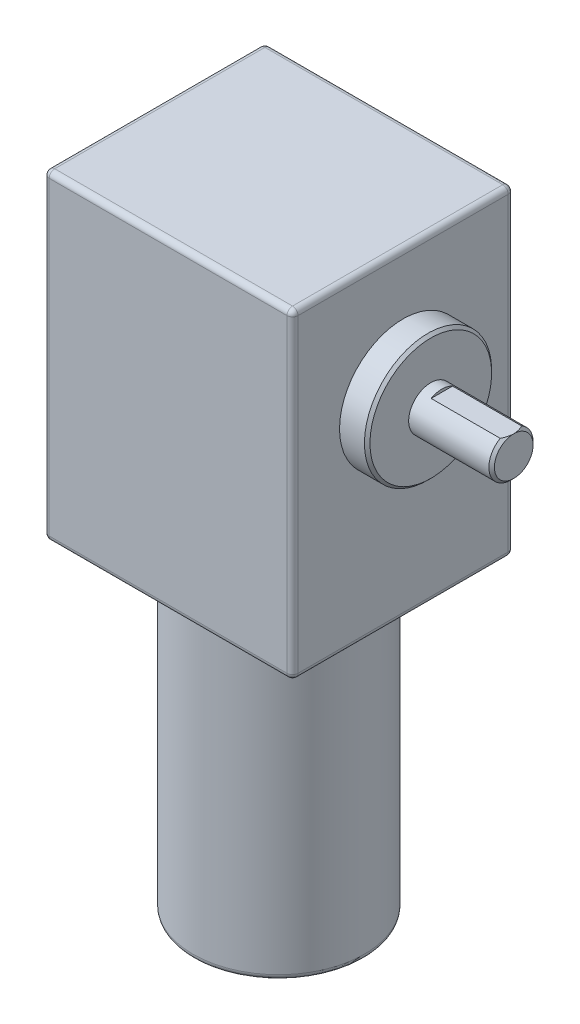
ISO-10303-21;
HEADER;
FILE_DESCRIPTION(('STEP AP214'),'2;1');
FILE_NAME('part.step','',(''),(''),'','','');
FILE_SCHEMA(('AUTOMOTIVE_DESIGN { 1 0 10303 214 1 1 1 1 }'));
ENDSEC;
DATA;
#1=APPLICATION_CONTEXT('core data for automotive mechanical design processes');
#2=APPLICATION_PROTOCOL_DEFINITION('international standard','automotive_design',2000,#1);
#3=PRODUCT_CONTEXT('',#1,'mechanical');
#4=PRODUCT('Part','Part','',(#3));
#5=PRODUCT_RELATED_PRODUCT_CATEGORY('part','',(#4));
#6=PRODUCT_DEFINITION_FORMATION('','',#4);
#7=PRODUCT_DEFINITION_CONTEXT('part definition',#1,'design');
#8=PRODUCT_DEFINITION('design','',#6,#7);
#9=PRODUCT_DEFINITION_SHAPE('','',#8);
#10=(LENGTH_UNIT() NAMED_UNIT(*) SI_UNIT(.MILLI.,.METRE.));
#11=(NAMED_UNIT(*) PLANE_ANGLE_UNIT() SI_UNIT($,.RADIAN.));
#12=(NAMED_UNIT(*) SI_UNIT($,.STERADIAN.) SOLID_ANGLE_UNIT());
#13=UNCERTAINTY_MEASURE_WITH_UNIT(LENGTH_MEASURE(1.E-05),#10,'distance_accuracy_value','');
#14=(GEOMETRIC_REPRESENTATION_CONTEXT(3) GLOBAL_UNCERTAINTY_ASSIGNED_CONTEXT((#13)) GLOBAL_UNIT_ASSIGNED_CONTEXT((#10,
#11,#12)) REPRESENTATION_CONTEXT('',''));
#15=CARTESIAN_POINT('',(0.,0.,0.));
#16=DIRECTION('',(0.,0.,1.));
#17=DIRECTION('',(1.,0.,0.));
#18=AXIS2_PLACEMENT_3D('',#15,#16,#17);
#19=CARTESIAN_POINT('',(15.,0.,0.));
#20=DIRECTION('',(-1.,0.,0.));
#21=DIRECTION('',(0.,0.,1.));
#22=AXIS2_PLACEMENT_3D('',#19,#20,#21);
#23=CYLINDRICAL_SURFACE('',#22,4.);
#24=CARTESIAN_POINT('',(14.5,0.,0.));
#25=DIRECTION('',(1.,0.,0.));
#26=DIRECTION('',(0.,0.,-1.));
#27=AXIS2_PLACEMENT_3D('',#24,#25,#26);
#28=CIRCLE('',#27,4.);
#29=CARTESIAN_POINT('',(14.5,3.5,-1.93649167310371));
#30=VERTEX_POINT('',#29);
#31=CARTESIAN_POINT('',(14.5,3.5,1.93649167310371));
#32=VERTEX_POINT('',#31);
#33=EDGE_CURVE('E158',#30,#32,#28,.F.);
#34=ORIENTED_EDGE('',*,*,#33,.T.);
#35=DIRECTION('',(1.,0.,0.));
#36=VECTOR('',#35,1.);
#37=CARTESIAN_POINT('',(2.,3.5,1.93649167310371));
#38=LINE('',#37,#36);
#39=CARTESIAN_POINT('',(2.,3.5,1.93649167310371));
#40=VERTEX_POINT('',#39);
#41=EDGE_CURVE('E151',#40,#32,#38,.T.);
#42=ORIENTED_EDGE('',*,*,#41,.F.);
#43=CARTESIAN_POINT('',(2.,0.,0.));
#44=DIRECTION('',(1.,0.,0.));
#45=DIRECTION('',(0.,0.,-1.));
#46=AXIS2_PLACEMENT_3D('',#43,#44,#45);
#47=CIRCLE('',#46,4.);
#48=CARTESIAN_POINT('',(2.,3.5,-1.93649167310371));
#49=VERTEX_POINT('',#48);
#50=EDGE_CURVE('E11',#49,#40,#47,.T.);
#51=ORIENTED_EDGE('',*,*,#50,.F.);
#52=DIRECTION('',(1.,0.,0.));
#53=VECTOR('',#52,1.);
#54=CARTESIAN_POINT('',(2.,3.5,-1.93649167310371));
#55=LINE('',#54,#53);
#56=EDGE_CURVE('E152',#49,#30,#55,.T.);
#57=ORIENTED_EDGE('',*,*,#56,.T.);
#58=EDGE_LOOP('',(#34,#42,#51,#57));
#59=FACE_BOUND('',#58,.T.);
#60=CARTESIAN_POINT('',(0.,0.,0.));
#61=DIRECTION('',(1.,0.,0.));
#62=DIRECTION('',(0.,0.,-1.));
#63=AXIS2_PLACEMENT_3D('',#60,#61,#62);
#64=CIRCLE('',#63,4.);
#65=CARTESIAN_POINT('',(0.,0.,-4.));
#66=VERTEX_POINT('',#65);
#67=EDGE_CURVE('E170',#66,#66,#64,.T.);
#68=ORIENTED_EDGE('',*,*,#67,.T.);
#69=EDGE_LOOP('',(#68));
#70=FACE_BOUND('',#69,.T.);
#71=ADVANCED_FACE('F40',(#59,#70),#23,.T.);
#72=CARTESIAN_POINT('',(15.,0.,0.));
#73=DIRECTION('',(1.,0.,0.));
#74=DIRECTION('',(0.,0.,-1.));
#75=AXIS2_PLACEMENT_3D('',#72,#73,#74);
#76=PLANE('',#75);
#77=CARTESIAN_POINT('',(15.,0.,0.));
#78=DIRECTION('',(1.,0.,0.));
#79=DIRECTION('',(0.,0.,-1.));
#80=AXIS2_PLACEMENT_3D('',#77,#78,#79);
#81=CIRCLE('',#80,3.50000000000002);
#82=CARTESIAN_POINT('',(15.,3.50000000000002,0.));
#83=VERTEX_POINT('',#82);
#84=EDGE_CURVE('E186',#83,#83,#81,.T.);
#85=ORIENTED_EDGE('',*,*,#84,.T.);
#86=EDGE_LOOP('',(#85));
#87=FACE_BOUND('',#86,.T.);
#88=ADVANCED_FACE('F420',(#87),#76,.T.);
#89=CARTESIAN_POINT('',(-5.,0.,0.));
#90=DIRECTION('',(1.,0.,0.));
#91=DIRECTION('',(0.,0.,-1.));
#92=AXIS2_PLACEMENT_3D('',#89,#90,#91);
#93=CYLINDRICAL_SURFACE('',#92,11.5);
#94=CARTESIAN_POINT('',(-0.499999999999992,0.,0.));
#95=DIRECTION('',(-1.,0.,0.));
#96=DIRECTION('',(0.,0.,1.));
#97=AXIS2_PLACEMENT_3D('',#94,#95,#96);
#98=CIRCLE('',#97,11.5);
#99=CARTESIAN_POINT('',(-0.499999999999992,0.,11.5));
#100=VERTEX_POINT('',#99);
#101=EDGE_CURVE('E169',#100,#100,#98,.T.);
#102=ORIENTED_EDGE('',*,*,#101,.T.);
#103=EDGE_LOOP('',(#102));
#104=FACE_BOUND('',#103,.T.);
#105=CARTESIAN_POINT('',(-5.,0.,0.));
#106=DIRECTION('',(-1.,0.,0.));
#107=DIRECTION('',(0.,0.,1.));
#108=AXIS2_PLACEMENT_3D('',#105,#106,#107);
#109=CIRCLE('',#108,11.5);
#110=CARTESIAN_POINT('',(-5.,0.,11.5));
#111=VERTEX_POINT('',#110);
#112=EDGE_CURVE('E171',#111,#111,#109,.T.);
#113=ORIENTED_EDGE('',*,*,#112,.F.);
#114=EDGE_LOOP('',(#113));
#115=FACE_BOUND('',#114,.T.);
#116=ADVANCED_FACE('F416',(#104,#115),#93,.T.);
#117=CARTESIAN_POINT('',(0.,0.,0.));
#118=DIRECTION('',(-1.,0.,0.));
#119=DIRECTION('',(0.,0.,1.));
#120=AXIS2_PLACEMENT_3D('',#117,#118,#119);
#121=PLANE('',#120);
#122=CARTESIAN_POINT('',(0.,0.,0.));
#123=DIRECTION('',(-1.,0.,0.));
#124=DIRECTION('',(0.,0.,1.));
#125=AXIS2_PLACEMENT_3D('',#122,#123,#124);
#126=CIRCLE('',#125,11.);
#127=CARTESIAN_POINT('',(0.,0.,11.));
#128=VERTEX_POINT('',#127);
#129=EDGE_CURVE('E182',#128,#128,#126,.F.);
#130=ORIENTED_EDGE('',*,*,#129,.T.);
#131=EDGE_LOOP('',(#130));
#132=FACE_BOUND('',#131,.T.);
#133=ORIENTED_EDGE('',*,*,#67,.F.);
#134=EDGE_LOOP('',(#133));
#135=FACE_BOUND('',#134,.T.);
#136=ADVANCED_FACE('F413',(#132,#135),#121,.F.);
#137=CARTESIAN_POINT('',(-50.,-35.5,-20.));
#138=DIRECTION('',(0.,0.,1.));
#139=DIRECTION('',(1.,0.,0.));
#140=AXIS2_PLACEMENT_3D('',#137,#138,#139);
#141=PLANE('',#140);
#142=DIRECTION('',(0.,-1.,0.));
#143=VECTOR('',#142,1.);
#144=CARTESIAN_POINT('',(-49.,22.5,-20.));
#145=LINE('',#144,#143);
#146=CARTESIAN_POINT('',(-49.,-34.5,-20.));
#147=VERTEX_POINT('',#146);
#148=CARTESIAN_POINT('',(-49.,21.5,-20.));
#149=VERTEX_POINT('',#148);
#150=EDGE_CURVE('E63',#147,#149,#145,.F.);
#151=ORIENTED_EDGE('',*,*,#150,.T.);
#152=DIRECTION('',(1.,0.,0.));
#153=VECTOR('',#152,1.);
#154=CARTESIAN_POINT('',(-50.,21.5,-20.));
#155=LINE('',#154,#153);
#156=CARTESIAN_POINT('',(-6.,21.5,-20.));
#157=VERTEX_POINT('',#156);
#158=EDGE_CURVE('E265',#149,#157,#155,.T.);
#159=ORIENTED_EDGE('',*,*,#158,.T.);
#160=DIRECTION('',(0.,-1.,0.));
#161=VECTOR('',#160,1.);
#162=CARTESIAN_POINT('',(-6.,-35.5,-20.));
#163=LINE('',#162,#161);
#164=CARTESIAN_POINT('',(-6.,-34.5,-20.));
#165=VERTEX_POINT('',#164);
#166=EDGE_CURVE('E257',#157,#165,#163,.T.);
#167=ORIENTED_EDGE('',*,*,#166,.T.);
#168=DIRECTION('',(1.,0.,0.));
#169=VECTOR('',#168,1.);
#170=CARTESIAN_POINT('',(-50.,-34.5,-20.));
#171=LINE('',#170,#169);
#172=EDGE_CURVE('E260',#165,#147,#171,.F.);
#173=ORIENTED_EDGE('',*,*,#172,.T.);
#174=EDGE_LOOP('',(#151,#159,#167,#173));
#175=FACE_BOUND('',#174,.T.);
#176=ADVANCED_FACE('F409',(#175),#141,.F.);
#177=CARTESIAN_POINT('',(-50.,-35.5,20.));
#178=DIRECTION('',(0.,1.,0.));
#179=DIRECTION('',(0.,0.,1.));
#180=AXIS2_PLACEMENT_3D('',#177,#178,#179);
#181=PLANE('',#180);
#182=DIRECTION('',(0.,0.,1.));
#183=VECTOR('',#182,1.);
#184=CARTESIAN_POINT('',(-6.,-35.5,20.));
#185=LINE('',#184,#183);
#186=CARTESIAN_POINT('',(-6.,-35.5,-19.));
#187=VERTEX_POINT('',#186);
#188=CARTESIAN_POINT('',(-6.,-35.5,19.));
#189=VERTEX_POINT('',#188);
#190=EDGE_CURVE('E208',#187,#189,#185,.T.);
#191=ORIENTED_EDGE('',*,*,#190,.T.);
#192=DIRECTION('',(1.,0.,0.));
#193=VECTOR('',#192,1.);
#194=CARTESIAN_POINT('',(-50.,-35.5,19.));
#195=LINE('',#194,#193);
#196=CARTESIAN_POINT('',(-49.,-35.5,19.));
#197=VERTEX_POINT('',#196);
#198=EDGE_CURVE('E215',#189,#197,#195,.F.);
#199=ORIENTED_EDGE('',*,*,#198,.T.);
#200=DIRECTION('',(0.,0.,1.));
#201=VECTOR('',#200,1.);
#202=CARTESIAN_POINT('',(-49.,-35.5,-20.));
#203=LINE('',#202,#201);
#204=CARTESIAN_POINT('',(-49.,-35.5,-19.));
#205=VERTEX_POINT('',#204);
#206=EDGE_CURVE('E211',#197,#205,#203,.F.);
#207=ORIENTED_EDGE('',*,*,#206,.T.);
#208=DIRECTION('',(1.,0.,0.));
#209=VECTOR('',#208,1.);
#210=CARTESIAN_POINT('',(-50.,-35.5,-19.));
#211=LINE('',#210,#209);
#212=EDGE_CURVE('E205',#205,#187,#211,.T.);
#213=ORIENTED_EDGE('',*,*,#212,.T.);
#214=EDGE_LOOP('',(#191,#199,#207,#213));
#215=FACE_BOUND('',#214,.T.);
#216=CARTESIAN_POINT('',(-27.5,-35.5,0.));
#217=DIRECTION('',(0.,-1.,0.));
#218=DIRECTION('',(0.,0.,-1.));
#219=AXIS2_PLACEMENT_3D('',#216,#217,#218);
#220=CIRCLE('',#219,15.5);
#221=CARTESIAN_POINT('',(-27.5,-35.5,15.5));
#222=VERTEX_POINT('',#221);
#223=EDGE_CURVE('E165',#222,#222,#220,.T.);
#224=ORIENTED_EDGE('',*,*,#223,.F.);
#225=EDGE_LOOP('',(#224));
#226=FACE_BOUND('',#225,.T.);
#227=ADVANCED_FACE('F405',(#215,#226),#181,.F.);
#228=CARTESIAN_POINT('',(-50.,-35.5,20.));
#229=DIRECTION('',(0.,0.,-1.));
#230=DIRECTION('',(-1.,0.,0.));
#231=AXIS2_PLACEMENT_3D('',#228,#229,#230);
#232=PLANE('',#231);
#233=DIRECTION('',(0.,1.,0.));
#234=VECTOR('',#233,1.);
#235=CARTESIAN_POINT('',(-49.,-35.5,20.));
#236=LINE('',#235,#234);
#237=CARTESIAN_POINT('',(-49.,21.5,20.));
#238=VERTEX_POINT('',#237);
#239=CARTESIAN_POINT('',(-49.,-34.5,20.));
#240=VERTEX_POINT('',#239);
#241=EDGE_CURVE('E250',#238,#240,#236,.F.);
#242=ORIENTED_EDGE('',*,*,#241,.T.);
#243=DIRECTION('',(1.,0.,0.));
#244=VECTOR('',#243,1.);
#245=CARTESIAN_POINT('',(-50.,-34.5,20.));
#246=LINE('',#245,#244);
#247=CARTESIAN_POINT('',(-6.,-34.5,20.));
#248=VERTEX_POINT('',#247);
#249=EDGE_CURVE('E253',#240,#248,#246,.T.);
#250=ORIENTED_EDGE('',*,*,#249,.T.);
#251=DIRECTION('',(0.,1.,0.));
#252=VECTOR('',#251,1.);
#253=CARTESIAN_POINT('',(-6.,-35.5,20.));
#254=LINE('',#253,#252);
#255=CARTESIAN_POINT('',(-6.,21.5,20.));
#256=VERTEX_POINT('',#255);
#257=EDGE_CURVE('E244',#248,#256,#254,.T.);
#258=ORIENTED_EDGE('',*,*,#257,.T.);
#259=DIRECTION('',(1.,0.,0.));
#260=VECTOR('',#259,1.);
#261=CARTESIAN_POINT('',(-50.,21.5,20.));
#262=LINE('',#261,#260);
#263=EDGE_CURVE('E247',#256,#238,#262,.F.);
#264=ORIENTED_EDGE('',*,*,#263,.T.);
#265=EDGE_LOOP('',(#242,#250,#258,#264));
#266=FACE_BOUND('',#265,.T.);
#267=ADVANCED_FACE('F401',(#266),#232,.F.);
#268=CARTESIAN_POINT('',(-50.,22.5,20.));
#269=DIRECTION('',(0.,-1.,0.));
#270=DIRECTION('',(0.,0.,-1.));
#271=AXIS2_PLACEMENT_3D('',#268,#269,#270);
#272=PLANE('',#271);
#273=DIRECTION('',(0.,0.,-1.));
#274=VECTOR('',#273,1.);
#275=CARTESIAN_POINT('',(-49.,22.5,20.));
#276=LINE('',#275,#274);
#277=CARTESIAN_POINT('',(-49.,22.5,-19.));
#278=VERTEX_POINT('',#277);
#279=CARTESIAN_POINT('',(-49.,22.5,19.));
#280=VERTEX_POINT('',#279);
#281=EDGE_CURVE('E237',#278,#280,#276,.F.);
#282=ORIENTED_EDGE('',*,*,#281,.T.);
#283=DIRECTION('',(1.,0.,0.));
#284=VECTOR('',#283,1.);
#285=CARTESIAN_POINT('',(-50.,22.5,19.));
#286=LINE('',#285,#284);
#287=CARTESIAN_POINT('',(-6.,22.5,19.));
#288=VERTEX_POINT('',#287);
#289=EDGE_CURVE('E241',#280,#288,#286,.T.);
#290=ORIENTED_EDGE('',*,*,#289,.T.);
#291=DIRECTION('',(0.,0.,-1.));
#292=VECTOR('',#291,1.);
#293=CARTESIAN_POINT('',(-6.,22.5,20.));
#294=LINE('',#293,#292);
#295=CARTESIAN_POINT('',(-6.,22.5,-19.));
#296=VERTEX_POINT('',#295);
#297=EDGE_CURVE('E234',#288,#296,#294,.T.);
#298=ORIENTED_EDGE('',*,*,#297,.T.);
#299=DIRECTION('',(1.,0.,0.));
#300=VECTOR('',#299,1.);
#301=CARTESIAN_POINT('',(-50.,22.5,-19.));
#302=LINE('',#301,#300);
#303=EDGE_CURVE('E231',#296,#278,#302,.F.);
#304=ORIENTED_EDGE('',*,*,#303,.T.);
#305=EDGE_LOOP('',(#282,#290,#298,#304));
#306=FACE_BOUND('',#305,.T.);
#307=ADVANCED_FACE('F394',(#306),#272,.F.);
#308=CARTESIAN_POINT('',(-50.,0.,0.));
#309=DIRECTION('',(-1.,0.,0.));
#310=DIRECTION('',(0.,0.,1.));
#311=AXIS2_PLACEMENT_3D('',#308,#309,#310);
#312=PLANE('',#311);
#313=DIRECTION('',(0.,0.,1.));
#314=VECTOR('',#313,1.);
#315=CARTESIAN_POINT('',(-50.,-34.5,20.));
#316=LINE('',#315,#314);
#317=CARTESIAN_POINT('',(-50.,-34.5,-19.));
#318=VERTEX_POINT('',#317);
#319=CARTESIAN_POINT('',(-50.,-34.5,19.));
#320=VERTEX_POINT('',#319);
#321=EDGE_CURVE('E198',#318,#320,#316,.T.);
#322=ORIENTED_EDGE('',*,*,#321,.T.);
#323=DIRECTION('',(0.,1.,0.));
#324=VECTOR('',#323,1.);
#325=CARTESIAN_POINT('',(-50.,22.5,19.));
#326=LINE('',#325,#324);
#327=CARTESIAN_POINT('',(-50.,21.5,19.));
#328=VERTEX_POINT('',#327);
#329=EDGE_CURVE('E202',#320,#328,#326,.T.);
#330=ORIENTED_EDGE('',*,*,#329,.T.);
#331=DIRECTION('',(0.,0.,-1.));
#332=VECTOR('',#331,1.);
#333=CARTESIAN_POINT('',(-50.,21.5,-20.));
#334=LINE('',#333,#332);
#335=CARTESIAN_POINT('',(-50.,21.5,-19.));
#336=VERTEX_POINT('',#335);
#337=EDGE_CURVE('E195',#328,#336,#334,.T.);
#338=ORIENTED_EDGE('',*,*,#337,.T.);
#339=DIRECTION('',(0.,-1.,0.));
#340=VECTOR('',#339,1.);
#341=CARTESIAN_POINT('',(-50.,-35.5,-19.));
#342=LINE('',#341,#340);
#343=EDGE_CURVE('E192',#336,#318,#342,.T.);
#344=ORIENTED_EDGE('',*,*,#343,.T.);
#345=EDGE_LOOP('',(#322,#330,#338,#344));
#346=FACE_BOUND('',#345,.T.);
#347=ADVANCED_FACE('F391',(#346),#312,.T.);
#348=CARTESIAN_POINT('',(-5.,0.,0.));
#349=DIRECTION('',(-1.,0.,0.));
#350=DIRECTION('',(0.,0.,1.));
#351=AXIS2_PLACEMENT_3D('',#348,#349,#350);
#352=PLANE('',#351);
#353=DIRECTION('',(0.,0.,-1.));
#354=VECTOR('',#353,1.);
#355=CARTESIAN_POINT('',(-5.,21.5,0.));
#356=LINE('',#355,#354);
#357=CARTESIAN_POINT('',(-5.,21.5,-19.));
#358=VERTEX_POINT('',#357);
#359=CARTESIAN_POINT('',(-5.,21.5,19.));
#360=VERTEX_POINT('',#359);
#361=EDGE_CURVE('E221',#358,#360,#356,.F.);
#362=ORIENTED_EDGE('',*,*,#361,.T.);
#363=DIRECTION('',(0.,1.,0.));
#364=VECTOR('',#363,1.);
#365=CARTESIAN_POINT('',(-5.,0.,19.));
#366=LINE('',#365,#364);
#367=CARTESIAN_POINT('',(-5.,-34.5,19.));
#368=VERTEX_POINT('',#367);
#369=EDGE_CURVE('E228',#360,#368,#366,.F.);
#370=ORIENTED_EDGE('',*,*,#369,.T.);
#371=DIRECTION('',(0.,0.,1.));
#372=VECTOR('',#371,1.);
#373=CARTESIAN_POINT('',(-5.,-34.5,0.));
#374=LINE('',#373,#372);
#375=CARTESIAN_POINT('',(-5.,-34.5,-19.));
#376=VERTEX_POINT('',#375);
#377=EDGE_CURVE('E224',#368,#376,#374,.F.);
#378=ORIENTED_EDGE('',*,*,#377,.T.);
#379=DIRECTION('',(0.,-1.,0.));
#380=VECTOR('',#379,1.);
#381=CARTESIAN_POINT('',(-5.,0.,-19.));
#382=LINE('',#381,#380);
#383=EDGE_CURVE('E218',#376,#358,#382,.F.);
#384=ORIENTED_EDGE('',*,*,#383,.T.);
#385=EDGE_LOOP('',(#362,#370,#378,#384));
#386=FACE_BOUND('',#385,.T.);
#387=ORIENTED_EDGE('',*,*,#112,.T.);
#388=EDGE_LOOP('',(#387));
#389=FACE_BOUND('',#388,.T.);
#390=ADVANCED_FACE('F389',(#386,#389),#352,.F.);
#391=CARTESIAN_POINT('',(-27.5,-92.5,0.));
#392=DIRECTION('',(0.,1.,0.));
#393=DIRECTION('',(0.,0.,1.));
#394=AXIS2_PLACEMENT_3D('',#391,#392,#393);
#395=CYLINDRICAL_SURFACE('',#394,15.5);
#396=CARTESIAN_POINT('',(-27.5,-91.5,0.));
#397=DIRECTION('',(0.,-1.,0.));
#398=DIRECTION('',(0.,0.,-1.));
#399=AXIS2_PLACEMENT_3D('',#396,#397,#398);
#400=CIRCLE('',#399,15.5);
#401=CARTESIAN_POINT('',(-27.5,-91.5,15.5));
#402=VERTEX_POINT('',#401);
#403=EDGE_CURVE('E272',#402,#402,#400,.F.);
#404=CARTESIAN_POINT('',(-27.5,-91.5,15.5));
#405=CARTESIAN_POINT('',(-27.5,-90.9166666666667,15.5));
#406=CARTESIAN_POINT('',(-27.5,-90.3333333333333,15.5));
#407=CARTESIAN_POINT('',(-27.5,-89.1666666666667,15.5));
#408=CARTESIAN_POINT('',(-27.5,-88.5833333333333,15.5));
#409=CARTESIAN_POINT('',(-27.5,-87.4166666666667,15.5));
#410=CARTESIAN_POINT('',(-27.5,-86.8333333333333,15.5));
#411=CARTESIAN_POINT('',(-27.5,-85.6666666666667,15.5));
#412=CARTESIAN_POINT('',(-27.5,-85.0833333333333,15.5));
#413=CARTESIAN_POINT('',(-27.5,-83.9166666666667,15.5));
#414=CARTESIAN_POINT('',(-27.5,-83.3333333333333,15.5));
#415=CARTESIAN_POINT('',(-27.5,-82.1666666666667,15.5));
#416=CARTESIAN_POINT('',(-27.5,-81.5833333333333,15.5));
#417=CARTESIAN_POINT('',(-27.5,-80.4166666666667,15.5));
#418=CARTESIAN_POINT('',(-27.5,-79.8333333333333,15.5));
#419=CARTESIAN_POINT('',(-27.5,-78.6666666666666,15.5));
#420=CARTESIAN_POINT('',(-27.5,-78.0833333333333,15.5));
#421=CARTESIAN_POINT('',(-27.5,-76.9166666666667,15.5));
#422=CARTESIAN_POINT('',(-27.5,-76.3333333333333,15.5));
#423=CARTESIAN_POINT('',(-27.5,-75.1666666666667,15.5));
#424=CARTESIAN_POINT('',(-27.5,-74.5833333333333,15.5));
#425=CARTESIAN_POINT('',(-27.5,-73.4166666666667,15.5));
#426=CARTESIAN_POINT('',(-27.5,-72.8333333333333,15.5));
#427=CARTESIAN_POINT('',(-27.5,-71.6666666666667,15.5));
#428=CARTESIAN_POINT('',(-27.5,-71.0833333333333,15.5));
#429=CARTESIAN_POINT('',(-27.5,-69.9166666666667,15.5));
#430=CARTESIAN_POINT('',(-27.5,-69.3333333333333,15.5));
#431=CARTESIAN_POINT('',(-27.5,-68.1666666666667,15.5));
#432=CARTESIAN_POINT('',(-27.5,-67.5833333333333,15.5));
#433=CARTESIAN_POINT('',(-27.5,-66.4166666666667,15.5));
#434=CARTESIAN_POINT('',(-27.5,-65.8333333333333,15.5));
#435=CARTESIAN_POINT('',(-27.5,-64.6666666666667,15.5));
#436=CARTESIAN_POINT('',(-27.5,-64.0833333333333,15.5));
#437=CARTESIAN_POINT('',(-27.5,-62.9166666666667,15.5));
#438=CARTESIAN_POINT('',(-27.5,-62.3333333333333,15.5));
#439=CARTESIAN_POINT('',(-27.5,-61.1666666666667,15.5));
#440=CARTESIAN_POINT('',(-27.5,-60.5833333333333,15.5));
#441=CARTESIAN_POINT('',(-27.5,-59.4166666666667,15.5));
#442=CARTESIAN_POINT('',(-27.5,-58.8333333333333,15.5));
#443=CARTESIAN_POINT('',(-27.5,-57.6666666666667,15.5));
#444=CARTESIAN_POINT('',(-27.5,-57.0833333333333,15.5));
#445=CARTESIAN_POINT('',(-27.5,-55.9166666666667,15.5));
#446=CARTESIAN_POINT('',(-27.5,-55.3333333333333,15.5));
#447=CARTESIAN_POINT('',(-27.5,-54.1666666666667,15.5));
#448=CARTESIAN_POINT('',(-27.5,-53.5833333333333,15.5));
#449=CARTESIAN_POINT('',(-27.5,-52.4166666666667,15.5));
#450=CARTESIAN_POINT('',(-27.5,-51.8333333333333,15.5));
#451=CARTESIAN_POINT('',(-27.5,-50.6666666666667,15.5));
#452=CARTESIAN_POINT('',(-27.5,-50.0833333333333,15.5));
#453=CARTESIAN_POINT('',(-27.5,-48.9166666666667,15.5));
#454=CARTESIAN_POINT('',(-27.5,-48.3333333333333,15.5));
#455=CARTESIAN_POINT('',(-27.5,-47.1666666666667,15.5));
#456=CARTESIAN_POINT('',(-27.5,-46.5833333333333,15.5));
#457=CARTESIAN_POINT('',(-27.5,-45.4166666666667,15.5));
#458=CARTESIAN_POINT('',(-27.5,-44.8333333333333,15.5));
#459=CARTESIAN_POINT('',(-27.5,-43.6666666666667,15.5));
#460=CARTESIAN_POINT('',(-27.5,-43.0833333333333,15.5));
#461=CARTESIAN_POINT('',(-27.5,-41.9166666666667,15.5));
#462=CARTESIAN_POINT('',(-27.5,-41.3333333333333,15.5));
#463=CARTESIAN_POINT('',(-27.5,-40.1666666666667,15.5));
#464=CARTESIAN_POINT('',(-27.5,-39.5833333333333,15.5));
#465=CARTESIAN_POINT('',(-27.5,-38.4166666666667,15.5));
#466=CARTESIAN_POINT('',(-27.5,-37.8333333333333,15.5));
#467=CARTESIAN_POINT('',(-27.5,-36.6666666666667,15.5));
#468=CARTESIAN_POINT('',(-27.5,-36.0833333333333,15.5));
#469=CARTESIAN_POINT('',(-27.5,-35.5,15.5));
#470=B_SPLINE_CURVE_WITH_KNOTS('',3,(#404,#405,#406,#407,#408,#409,#410,#411,#412,#413,#414,
#415,#416,#417,#418,#419,#420,#421,#422,#423,#424,#425,#426,#427,#428,#429,#430,#431,#432,#433,
#434,#435,#436,#437,#438,#439,#440,#441,#442,#443,#444,#445,#446,#447,#448,#449,#450,#451,#452,
#453,#454,#455,#456,#457,#458,#459,#460,#461,#462,#463,#464,#465,#466,#467,#468,#469),
.UNSPECIFIED.,.F.,.F.,(4,2,2,2,2,2,2,2,2,2,2,2,2,2,2,2,2,2,2,2,2,2,2,2,2,2,2,2,2,2,2,2,4),(0.,
1.74999999999999,3.49999999999999,5.24999999999999,6.99999999999999,8.74999999999999,10.5,12.25,
14.,15.75,17.5,19.25,21.,22.75,24.5,26.25,28.,29.75,31.5,33.25,35.,36.75,38.5,40.25,42.,43.75,
45.5,47.25,49.,50.75,52.5,54.25,56.),.UNSPECIFIED.);
#471=EDGE_CURVE('BSEAM385',#402,#222,#470,.T.);
#472=ORIENTED_EDGE('',*,*,#403,.T.);
#473=ORIENTED_EDGE('',*,*,#223,.T.);
#474=ORIENTED_EDGE('',*,*,#471,.T.);
#475=ORIENTED_EDGE('',*,*,#471,.F.);
#476=EDGE_LOOP('',(#472,#474,#473,#475));
#477=FACE_BOUND('',#476,.T.);
#478=ADVANCED_FACE('F385',(#477),#395,.T.);
#479=CARTESIAN_POINT('',(-27.5,-92.5,0.));
#480=DIRECTION('',(0.,-1.,0.));
#481=DIRECTION('',(0.,0.,-1.));
#482=AXIS2_PLACEMENT_3D('',#479,#480,#481);
#483=PLANE('',#482);
#484=CARTESIAN_POINT('',(-27.5,-92.5,0.));
#485=DIRECTION('',(0.,-1.,0.));
#486=DIRECTION('',(0.,0.,-1.));
#487=AXIS2_PLACEMENT_3D('',#484,#485,#486);
#488=CIRCLE('',#487,14.5);
#489=CARTESIAN_POINT('',(-27.5,-92.5,-14.5));
#490=VERTEX_POINT('',#489);
#491=EDGE_CURVE('E268',#490,#490,#488,.T.);
#492=ORIENTED_EDGE('',*,*,#491,.T.);
#493=EDGE_LOOP('',(#492));
#494=FACE_BOUND('',#493,.T.);
#495=ADVANCED_FACE('F381',(#494),#483,.T.);
#496=CARTESIAN_POINT('',(-0.499999999999992,0.,0.));
#497=DIRECTION('',(-1.,0.,0.));
#498=DIRECTION('',(0.,0.,1.));
#499=AXIS2_PLACEMENT_3D('',#496,#497,#498);
#500=CONICAL_SURFACE('',#499,11.5,0.785398163397447);
#501=ORIENTED_EDGE('',*,*,#129,.F.);
#502=EDGE_LOOP('',(#501));
#503=FACE_BOUND('',#502,.T.);
#504=ORIENTED_EDGE('',*,*,#101,.F.);
#505=EDGE_LOOP('',(#504));
#506=FACE_BOUND('',#505,.T.);
#507=ADVANCED_FACE('F384',(#503,#506),#500,.T.);
#508=CARTESIAN_POINT('',(15.,0.,0.));
#509=DIRECTION('',(-1.,0.,0.));
#510=DIRECTION('',(0.,0.,1.));
#511=AXIS2_PLACEMENT_3D('',#508,#509,#510);
#512=CONICAL_SURFACE('',#511,3.50000000000002,0.785398163397447);
#513=CARTESIAN_POINT('',(11.6899471258397,3.5,5.84181651105703));
#514=CARTESIAN_POINT('',(11.8395427861511,3.5,5.66735393936486));
#515=CARTESIAN_POINT('',(11.9881954210432,3.5,5.49206547113774));
#516=CARTESIAN_POINT('',(12.2829447720812,3.5,5.13920313663014));
#517=CARTESIAN_POINT('',(12.4290401400104,3.5,4.9616281456963));
#518=CARTESIAN_POINT('',(12.7216498436301,3.5,4.59902841847941));
#519=CARTESIAN_POINT('',(12.8680740607516,3.5,4.41393060280333));
#520=CARTESIAN_POINT('',(13.1560543006146,3.5,4.04004823799611));
#521=CARTESIAN_POINT('',(13.297611554435,3.5,3.85126464039525));
#522=CARTESIAN_POINT('',(13.5742819676444,3.5,3.4684717709667));
#523=CARTESIAN_POINT('',(13.709383433517,3.5,3.27445394365403));
#524=CARTESIAN_POINT('',(13.9047854482887,3.5,2.9784971811169));
#525=CARTESIAN_POINT('',(13.9687407444497,3.5,2.87897311573411));
#526=CARTESIAN_POINT('',(14.093657933459,3.5,2.67806902832483));
#527=CARTESIAN_POINT('',(14.1546200626617,3.5,2.57668915371245));
#528=CARTESIAN_POINT('',(14.2723345746304,3.5,2.37276611513997));
#529=CARTESIAN_POINT('',(14.3291212420944,3.5,2.27024294407419));
#530=CARTESIAN_POINT('',(14.4382656351064,3.5,2.06287588995989));
#531=CARTESIAN_POINT('',(14.490622835163,3.5,1.95803173341671));
#532=CARTESIAN_POINT('',(14.639392080392,3.5,1.63994654672309));
#533=CARTESIAN_POINT('',(14.727775746879,3.5,1.42269566249373));
#534=CARTESIAN_POINT('',(14.8370059061703,3.5,1.08589626758145));
#535=CARTESIAN_POINT('',(14.8697948321508,3.5,0.970207598620513));
#536=CARTESIAN_POINT('',(14.9251763288505,3.5,0.736379807759468));
#537=CARTESIAN_POINT('',(14.94777052291,3.5,0.618241079126182));
#538=CARTESIAN_POINT('',(14.9812859571545,3.5,0.380879908496849));
#539=CARTESIAN_POINT('',(14.992263710395,3.5,0.261665585444833));
#540=CARTESIAN_POINT('',(15.0019613422117,3.5,0.0227331034399934));
#541=CARTESIAN_POINT('',(15.0006817870024,3.5,-0.0969850319843476));
#542=CARTESIAN_POINT('',(14.9859714756814,3.5,-0.335487466432786));
#543=CARTESIAN_POINT('',(14.9725577561206,3.5,-0.454272839281214));
#544=CARTESIAN_POINT('',(14.9345295265572,3.5,-0.690022062147998));
#545=CARTESIAN_POINT('',(14.9099131164912,3.5,-0.806985599687082));
#546=CARTESIAN_POINT('',(14.8507452514513,3.5,-1.03910972308809));
#547=CARTESIAN_POINT('',(14.8161327378705,3.5,-1.15425449665019));
#548=CARTESIAN_POINT('',(14.7386658596439,3.5,-1.38169186109189));
#549=CARTESIAN_POINT('',(14.6958117485251,3.5,-1.49398453958702));
#550=CARTESIAN_POINT('',(14.5890420587657,3.5,-1.75015942781327));
#551=CARTESIAN_POINT('',(14.5227174659705,3.5,-1.89303092730609));
#552=CARTESIAN_POINT('',(14.3813440799751,3.5,-2.17442767273329));
#553=CARTESIAN_POINT('',(14.3062899304985,3.5,-2.31295018332319));
#554=CARTESIAN_POINT('',(14.1494392310383,3.5,-2.58649511142916));
#555=CARTESIAN_POINT('',(14.0676283145599,3.5,-2.72150922459222));
#556=CARTESIAN_POINT('',(13.8989905353675,3.5,-2.98830469597387));
#557=CARTESIAN_POINT('',(13.8121647448185,3.5,-3.12008673667948));
#558=CARTESIAN_POINT('',(13.6341931179746,3.5,-3.38161136797615));
#559=CARTESIAN_POINT('',(13.5430286049175,3.5,-3.51134118879959));
#560=CARTESIAN_POINT('',(13.3576081785151,3.5,-3.76857209228672));
#561=CARTESIAN_POINT('',(13.2633521395112,3.5,-3.89607308403343));
#562=CARTESIAN_POINT('',(13.0724926425957,3.5,-4.14906249810053));
#563=CARTESIAN_POINT('',(12.9758921161339,3.5,-4.27455313784457));
#564=CARTESIAN_POINT('',(12.7807020979541,3.5,-4.52397933448188));
#565=CARTESIAN_POINT('',(12.682112554998,3.5,-4.64791485118069));
#566=CARTESIAN_POINT('',(12.4363054496243,3.5,-4.95277252343934));
#567=CARTESIAN_POINT('',(12.2881385211466,3.5,-5.13292902069894));
#568=CARTESIAN_POINT('',(12.0644625856483,3.5,-5.4007881452577));
#569=CARTESIAN_POINT('',(11.9899607875542,3.5,-5.48933647749916));
#570=CARTESIAN_POINT('',(11.840373832225,3.5,-5.66593520127804));
#571=CARTESIAN_POINT('',(11.765288690206,3.5,-5.75398560570074));
#572=CARTESIAN_POINT('',(11.6899471258398,3.5,-5.84181651105706));
#573=B_SPLINE_CURVE_WITH_KNOTS('',3,(#513,#514,#515,#516,#517,#518,#519,#520,#521,#522,#523,
#524,#525,#526,#527,#528,#529,#530,#531,#532,#533,#534,#535,#536,#537,#538,#539,#540,#541,#542,
#543,#544,#545,#546,#547,#548,#549,#550,#551,#552,#553,#554,#555,#556,#557,#558,#559,#560,#561,
#562,#563,#564,#565,#566,#567,#568,#569,#570,#571,#572),.UNSPECIFIED.,.F.,.F.,(4,2,2,2,2,2,2,2,
2,2,2,2,2,2,2,2,2,2,2,2,2,2,2,2,2,2,2,2,2,4),(0.,0.689468185585012,1.37928953616029,
2.08726122955687,2.79505250676938,3.50408066758653,3.85894382643688,4.21377891840809,
4.56526700626636,4.91679673474138,5.6182622265377,5.97863378950202,6.33894794905833,
6.69750103491053,7.05603755783257,7.41407147000541,7.77216613015949,8.13249613527578,
8.4928150577387,8.96494773972697,9.43737165621834,9.91082727948629,10.3841820513867,
10.8598009205065,11.3354391457107,11.8105105208123,12.2855941496473,12.9853321556878,
13.33249318543,13.6796451899034),.UNSPECIFIED.);
#574=EDGE_CURVE('E49',#32,#83,#573,.T.);
#575=ORIENTED_EDGE('',*,*,#574,.F.);
#576=ORIENTED_EDGE('',*,*,#33,.F.);
#577=EDGE_CURVE('E276',#83,#30,#573,.T.);
#578=ORIENTED_EDGE('',*,*,#577,.F.);
#579=ORIENTED_EDGE('',*,*,#84,.F.);
#580=EDGE_LOOP('',(#575,#576,#578,#579));
#581=FACE_BOUND('',#580,.T.);
#582=ADVANCED_FACE('F373',(#581),#512,.T.);
#583=CARTESIAN_POINT('',(-6.,21.5,20.));
#584=DIRECTION('',(0.,0.,-1.));
#585=DIRECTION('',(-1.,0.,0.));
#586=AXIS2_PLACEMENT_3D('',#583,#584,#585);
#587=CYLINDRICAL_SURFACE('',#586,1.);
#588=CARTESIAN_POINT('',(-6.,21.5,-19.));
#589=DIRECTION('',(0.,0.,-1.));
#590=DIRECTION('',(-1.,0.,0.));
#591=AXIS2_PLACEMENT_3D('',#588,#589,#590);
#592=CIRCLE('',#591,1.);
#593=EDGE_CURVE('E175',#296,#358,#592,.T.);
#594=ORIENTED_EDGE('',*,*,#593,.F.);
#595=ORIENTED_EDGE('',*,*,#297,.F.);
#596=CARTESIAN_POINT('',(-6.,21.5,19.));
#597=DIRECTION('',(0.,0.,1.));
#598=DIRECTION('',(1.,0.,0.));
#599=AXIS2_PLACEMENT_3D('',#596,#597,#598);
#600=CIRCLE('',#599,1.);
#601=EDGE_CURVE('E359',#360,#288,#600,.T.);
#602=ORIENTED_EDGE('',*,*,#601,.F.);
#603=ORIENTED_EDGE('',*,*,#361,.F.);
#604=EDGE_LOOP('',(#594,#595,#602,#603));
#605=FACE_BOUND('',#604,.T.);
#606=ADVANCED_FACE('F434',(#605),#587,.T.);
#607=CARTESIAN_POINT('',(-6.,21.5,-19.));
#608=DIRECTION('',(0.,0.,1.));
#609=DIRECTION('',(1.,0.,0.));
#610=AXIS2_PLACEMENT_3D('',#607,#608,#609);
#611=SPHERICAL_SURFACE('',#610,1.);
#612=CARTESIAN_POINT('',(-6.,21.5,-19.));
#613=DIRECTION('',(1.,0.,0.));
#614=DIRECTION('',(0.,0.,-1.));
#615=AXIS2_PLACEMENT_3D('',#612,#613,#614);
#616=CIRCLE('',#615,1.);
#617=EDGE_CURVE('E351',#296,#157,#616,.F.);
#618=ORIENTED_EDGE('',*,*,#617,.F.);
#619=ORIENTED_EDGE('',*,*,#593,.T.);
#620=CARTESIAN_POINT('',(-6.,21.5,-19.));
#621=DIRECTION('',(0.,1.,0.));
#622=DIRECTION('',(0.,0.,1.));
#623=AXIS2_PLACEMENT_3D('',#620,#621,#622);
#624=CIRCLE('',#623,1.);
#625=EDGE_CURVE('E355',#157,#358,#624,.F.);
#626=ORIENTED_EDGE('',*,*,#625,.F.);
#627=EDGE_LOOP('',(#618,#619,#626));
#628=FACE_BOUND('',#627,.T.);
#629=ADVANCED_FACE('F447',(#628),#611,.T.);
#630=CARTESIAN_POINT('',(-6.,21.5,19.));
#631=DIRECTION('',(0.,0.,1.));
#632=DIRECTION('',(1.,0.,0.));
#633=AXIS2_PLACEMENT_3D('',#630,#631,#632);
#634=SPHERICAL_SURFACE('',#633,1.);
#635=CARTESIAN_POINT('',(-6.,21.5,19.));
#636=DIRECTION('',(0.,1.,0.));
#637=DIRECTION('',(0.,0.,1.));
#638=AXIS2_PLACEMENT_3D('',#635,#636,#637);
#639=CIRCLE('',#638,1.);
#640=EDGE_CURVE('E343',#360,#256,#639,.F.);
#641=ORIENTED_EDGE('',*,*,#640,.F.);
#642=ORIENTED_EDGE('',*,*,#601,.T.);
#643=CARTESIAN_POINT('',(-6.,21.5,19.));
#644=DIRECTION('',(1.,0.,0.));
#645=DIRECTION('',(0.,0.,-1.));
#646=AXIS2_PLACEMENT_3D('',#643,#644,#645);
#647=CIRCLE('',#646,1.);
#648=EDGE_CURVE('E347',#256,#288,#647,.F.);
#649=ORIENTED_EDGE('',*,*,#648,.F.);
#650=EDGE_LOOP('',(#641,#642,#649));
#651=FACE_BOUND('',#650,.T.);
#652=ADVANCED_FACE('F454',(#651),#634,.T.);
#653=CARTESIAN_POINT('',(-6.,-35.5,-19.));
#654=DIRECTION('',(0.,-1.,0.));
#655=DIRECTION('',(0.,0.,-1.));
#656=AXIS2_PLACEMENT_3D('',#653,#654,#655);
#657=CYLINDRICAL_SURFACE('',#656,1.);
#658=ORIENTED_EDGE('',*,*,#625,.T.);
#659=ORIENTED_EDGE('',*,*,#383,.F.);
#660=CARTESIAN_POINT('',(-6.,-34.5,-19.));
#661=DIRECTION('',(0.,-1.,0.));
#662=DIRECTION('',(0.,0.,-1.));
#663=AXIS2_PLACEMENT_3D('',#660,#661,#662);
#664=CIRCLE('',#663,1.);
#665=EDGE_CURVE('E336',#165,#376,#664,.T.);
#666=ORIENTED_EDGE('',*,*,#665,.F.);
#667=ORIENTED_EDGE('',*,*,#166,.F.);
#668=EDGE_LOOP('',(#658,#659,#666,#667));
#669=FACE_BOUND('',#668,.T.);
#670=ADVANCED_FACE('F461',(#669),#657,.T.);
#671=CARTESIAN_POINT('',(-50.,21.5,-19.));
#672=DIRECTION('',(1.,0.,0.));
#673=DIRECTION('',(0.,0.,-1.));
#674=AXIS2_PLACEMENT_3D('',#671,#672,#673);
#675=CYLINDRICAL_SURFACE('',#674,1.);
#676=ORIENTED_EDGE('',*,*,#617,.T.);
#677=ORIENTED_EDGE('',*,*,#158,.F.);
#678=CARTESIAN_POINT('',(-49.,21.5,-19.));
#679=DIRECTION('',(-1.,0.,0.));
#680=DIRECTION('',(0.,0.,1.));
#681=AXIS2_PLACEMENT_3D('',#678,#679,#680);
#682=CIRCLE('',#681,1.);
#683=EDGE_CURVE('E332',#278,#149,#682,.T.);
#684=ORIENTED_EDGE('',*,*,#683,.F.);
#685=ORIENTED_EDGE('',*,*,#303,.F.);
#686=EDGE_LOOP('',(#676,#677,#684,#685));
#687=FACE_BOUND('',#686,.T.);
#688=ADVANCED_FACE('F465',(#687),#675,.T.);
#689=CARTESIAN_POINT('',(-49.,21.5,0.));
#690=DIRECTION('',(0.,0.,1.));
#691=DIRECTION('',(1.,0.,0.));
#692=AXIS2_PLACEMENT_3D('',#689,#690,#691);
#693=CYLINDRICAL_SURFACE('',#692,1.);
#694=CARTESIAN_POINT('',(-49.,21.5,19.));
#695=DIRECTION('',(0.,0.,1.));
#696=DIRECTION('',(1.,0.,0.));
#697=AXIS2_PLACEMENT_3D('',#694,#695,#696);
#698=CIRCLE('',#697,1.);
#699=EDGE_CURVE('E324',#280,#328,#698,.T.);
#700=ORIENTED_EDGE('',*,*,#699,.F.);
#701=ORIENTED_EDGE('',*,*,#281,.F.);
#702=CARTESIAN_POINT('',(-49.,21.5,-19.));
#703=DIRECTION('',(0.,0.,-1.));
#704=DIRECTION('',(-1.,0.,0.));
#705=AXIS2_PLACEMENT_3D('',#702,#703,#704);
#706=CIRCLE('',#705,1.);
#707=EDGE_CURVE('E328',#336,#278,#706,.T.);
#708=ORIENTED_EDGE('',*,*,#707,.F.);
#709=ORIENTED_EDGE('',*,*,#337,.F.);
#710=EDGE_LOOP('',(#700,#701,#708,#709));
#711=FACE_BOUND('',#710,.T.);
#712=ADVANCED_FACE('F469',(#711),#693,.T.);
#713=CARTESIAN_POINT('',(-50.,21.5,19.));
#714=DIRECTION('',(1.,0.,0.));
#715=DIRECTION('',(0.,0.,-1.));
#716=AXIS2_PLACEMENT_3D('',#713,#714,#715);
#717=CYLINDRICAL_SURFACE('',#716,1.);
#718=ORIENTED_EDGE('',*,*,#648,.T.);
#719=ORIENTED_EDGE('',*,*,#289,.F.);
#720=CARTESIAN_POINT('',(-49.,21.5,19.));
#721=DIRECTION('',(-1.,0.,0.));
#722=DIRECTION('',(0.,0.,1.));
#723=AXIS2_PLACEMENT_3D('',#720,#721,#722);
#724=CIRCLE('',#723,1.);
#725=EDGE_CURVE('E321',#238,#280,#724,.T.);
#726=ORIENTED_EDGE('',*,*,#725,.F.);
#727=ORIENTED_EDGE('',*,*,#263,.F.);
#728=EDGE_LOOP('',(#718,#719,#726,#727));
#729=FACE_BOUND('',#728,.T.);
#730=ADVANCED_FACE('F473',(#729),#717,.T.);
#731=CARTESIAN_POINT('',(-6.,-35.5,19.));
#732=DIRECTION('',(0.,1.,0.));
#733=DIRECTION('',(0.,0.,1.));
#734=AXIS2_PLACEMENT_3D('',#731,#732,#733);
#735=CYLINDRICAL_SURFACE('',#734,1.);
#736=ORIENTED_EDGE('',*,*,#640,.T.);
#737=ORIENTED_EDGE('',*,*,#257,.F.);
#738=CARTESIAN_POINT('',(-6.,-34.5,19.));
#739=DIRECTION('',(0.,-1.,0.));
#740=DIRECTION('',(0.,0.,-1.));
#741=AXIS2_PLACEMENT_3D('',#738,#739,#740);
#742=CIRCLE('',#741,1.);
#743=EDGE_CURVE('E317',#368,#248,#742,.T.);
#744=ORIENTED_EDGE('',*,*,#743,.F.);
#745=ORIENTED_EDGE('',*,*,#369,.F.);
#746=EDGE_LOOP('',(#736,#737,#744,#745));
#747=FACE_BOUND('',#746,.T.);
#748=ADVANCED_FACE('F477',(#747),#735,.T.);
#749=CARTESIAN_POINT('',(-6.,-34.5,20.));
#750=DIRECTION('',(0.,0.,1.));
#751=DIRECTION('',(1.,0.,0.));
#752=AXIS2_PLACEMENT_3D('',#749,#750,#751);
#753=CYLINDRICAL_SURFACE('',#752,1.);
#754=CARTESIAN_POINT('',(-6.,-34.5,-19.));
#755=DIRECTION('',(0.,0.,-1.));
#756=DIRECTION('',(0.,1.,0.));
#757=AXIS2_PLACEMENT_3D('',#754,#755,#756);
#758=CIRCLE('',#757,1.);
#759=EDGE_CURVE('E339',#376,#187,#758,.T.);
#760=ORIENTED_EDGE('',*,*,#759,.F.);
#761=ORIENTED_EDGE('',*,*,#377,.F.);
#762=CARTESIAN_POINT('',(-6.,-34.5,19.));
#763=DIRECTION('',(0.,0.,1.));
#764=DIRECTION('',(1.,0.,0.));
#765=AXIS2_PLACEMENT_3D('',#762,#763,#764);
#766=CIRCLE('',#765,1.);
#767=EDGE_CURVE('E313',#189,#368,#766,.T.);
#768=ORIENTED_EDGE('',*,*,#767,.F.);
#769=ORIENTED_EDGE('',*,*,#190,.F.);
#770=EDGE_LOOP('',(#760,#761,#768,#769));
#771=FACE_BOUND('',#770,.T.);
#772=ADVANCED_FACE('F481',(#771),#753,.T.);
#773=CARTESIAN_POINT('',(-6.,-34.5,-19.));
#774=DIRECTION('',(0.,0.,1.));
#775=DIRECTION('',(1.,0.,0.));
#776=AXIS2_PLACEMENT_3D('',#773,#774,#775);
#777=SPHERICAL_SURFACE('',#776,1.);
#778=ORIENTED_EDGE('',*,*,#665,.T.);
#779=ORIENTED_EDGE('',*,*,#759,.T.);
#780=CARTESIAN_POINT('',(-6.,-34.5,-19.));
#781=DIRECTION('',(1.,0.,0.));
#782=DIRECTION('',(0.,0.,-1.));
#783=AXIS2_PLACEMENT_3D('',#780,#781,#782);
#784=CIRCLE('',#783,1.);
#785=EDGE_CURVE('E309',#165,#187,#784,.F.);
#786=ORIENTED_EDGE('',*,*,#785,.F.);
#787=EDGE_LOOP('',(#778,#779,#786));
#788=FACE_BOUND('',#787,.T.);
#789=ADVANCED_FACE('F485',(#788),#777,.T.);
#790=CARTESIAN_POINT('',(-49.,21.5,-19.));
#791=DIRECTION('',(0.,0.,1.));
#792=DIRECTION('',(1.,0.,0.));
#793=AXIS2_PLACEMENT_3D('',#790,#791,#792);
#794=SPHERICAL_SURFACE('',#793,1.);
#795=ORIENTED_EDGE('',*,*,#707,.T.);
#796=ORIENTED_EDGE('',*,*,#683,.T.);
#797=CARTESIAN_POINT('',(-49.,21.5,-19.));
#798=DIRECTION('',(0.,1.,0.));
#799=DIRECTION('',(0.,0.,1.));
#800=AXIS2_PLACEMENT_3D('',#797,#798,#799);
#801=CIRCLE('',#800,1.);
#802=EDGE_CURVE('E305',#336,#149,#801,.F.);
#803=ORIENTED_EDGE('',*,*,#802,.F.);
#804=EDGE_LOOP('',(#795,#796,#803));
#805=FACE_BOUND('',#804,.T.);
#806=ADVANCED_FACE('F489',(#805),#794,.T.);
#807=CARTESIAN_POINT('',(-49.,21.5,19.));
#808=DIRECTION('',(0.,0.,1.));
#809=DIRECTION('',(1.,0.,0.));
#810=AXIS2_PLACEMENT_3D('',#807,#808,#809);
#811=SPHERICAL_SURFACE('',#810,1.);
#812=ORIENTED_EDGE('',*,*,#725,.T.);
#813=ORIENTED_EDGE('',*,*,#699,.T.);
#814=CARTESIAN_POINT('',(-49.,21.5,19.));
#815=DIRECTION('',(0.,1.,0.));
#816=DIRECTION('',(0.,0.,1.));
#817=AXIS2_PLACEMENT_3D('',#814,#815,#816);
#818=CIRCLE('',#817,1.);
#819=EDGE_CURVE('E301',#238,#328,#818,.F.);
#820=ORIENTED_EDGE('',*,*,#819,.F.);
#821=EDGE_LOOP('',(#812,#813,#820));
#822=FACE_BOUND('',#821,.T.);
#823=ADVANCED_FACE('F493',(#822),#811,.T.);
#824=CARTESIAN_POINT('',(-6.,-34.5,19.));
#825=DIRECTION('',(0.,0.,1.));
#826=DIRECTION('',(1.,0.,0.));
#827=AXIS2_PLACEMENT_3D('',#824,#825,#826);
#828=SPHERICAL_SURFACE('',#827,1.);
#829=ORIENTED_EDGE('',*,*,#767,.T.);
#830=ORIENTED_EDGE('',*,*,#743,.T.);
#831=CARTESIAN_POINT('',(-6.,-34.5,19.));
#832=DIRECTION('',(1.,0.,0.));
#833=DIRECTION('',(0.,0.,-1.));
#834=AXIS2_PLACEMENT_3D('',#831,#832,#833);
#835=CIRCLE('',#834,1.);
#836=EDGE_CURVE('E298',#189,#248,#835,.F.);
#837=ORIENTED_EDGE('',*,*,#836,.F.);
#838=EDGE_LOOP('',(#829,#830,#837));
#839=FACE_BOUND('',#838,.T.);
#840=ADVANCED_FACE('F497',(#839),#828,.T.);
#841=CARTESIAN_POINT('',(-50.,-34.5,-19.));
#842=DIRECTION('',(1.,0.,0.));
#843=DIRECTION('',(0.,0.,-1.));
#844=AXIS2_PLACEMENT_3D('',#841,#842,#843);
#845=CYLINDRICAL_SURFACE('',#844,1.);
#846=ORIENTED_EDGE('',*,*,#785,.T.);
#847=ORIENTED_EDGE('',*,*,#212,.F.);
#848=CARTESIAN_POINT('',(-49.,-34.5,-19.));
#849=DIRECTION('',(-1.,0.,0.));
#850=DIRECTION('',(0.,0.,1.));
#851=AXIS2_PLACEMENT_3D('',#848,#849,#850);
#852=CIRCLE('',#851,1.);
#853=EDGE_CURVE('E294',#147,#205,#852,.T.);
#854=ORIENTED_EDGE('',*,*,#853,.F.);
#855=ORIENTED_EDGE('',*,*,#172,.F.);
#856=EDGE_LOOP('',(#846,#847,#854,#855));
#857=FACE_BOUND('',#856,.T.);
#858=ADVANCED_FACE('F501',(#857),#845,.T.);
#859=CARTESIAN_POINT('',(-49.,0.,-19.));
#860=DIRECTION('',(0.,1.,0.));
#861=DIRECTION('',(0.,0.,1.));
#862=AXIS2_PLACEMENT_3D('',#859,#860,#861);
#863=CYLINDRICAL_SURFACE('',#862,1.);
#864=ORIENTED_EDGE('',*,*,#802,.T.);
#865=ORIENTED_EDGE('',*,*,#150,.F.);
#866=CARTESIAN_POINT('',(-49.,-34.5,-19.));
#867=DIRECTION('',(0.,-1.,0.));
#868=DIRECTION('',(0.,0.,-1.));
#869=AXIS2_PLACEMENT_3D('',#866,#867,#868);
#870=CIRCLE('',#869,1.);
#871=EDGE_CURVE('E290',#318,#147,#870,.T.);
#872=ORIENTED_EDGE('',*,*,#871,.F.);
#873=ORIENTED_EDGE('',*,*,#343,.F.);
#874=EDGE_LOOP('',(#864,#865,#872,#873));
#875=FACE_BOUND('',#874,.T.);
#876=ADVANCED_FACE('F505',(#875),#863,.T.);
#877=CARTESIAN_POINT('',(-49.,0.,19.));
#878=DIRECTION('',(0.,-1.,0.));
#879=DIRECTION('',(0.,0.,-1.));
#880=AXIS2_PLACEMENT_3D('',#877,#878,#879);
#881=CYLINDRICAL_SURFACE('',#880,1.);
#882=ORIENTED_EDGE('',*,*,#819,.T.);
#883=ORIENTED_EDGE('',*,*,#329,.F.);
#884=CARTESIAN_POINT('',(-49.,-34.5,19.));
#885=DIRECTION('',(0.,-1.,0.));
#886=DIRECTION('',(0.,0.,-1.));
#887=AXIS2_PLACEMENT_3D('',#884,#885,#886);
#888=CIRCLE('',#887,1.);
#889=EDGE_CURVE('E286',#240,#320,#888,.T.);
#890=ORIENTED_EDGE('',*,*,#889,.F.);
#891=ORIENTED_EDGE('',*,*,#241,.F.);
#892=EDGE_LOOP('',(#882,#883,#890,#891));
#893=FACE_BOUND('',#892,.T.);
#894=ADVANCED_FACE('F509',(#893),#881,.T.);
#895=CARTESIAN_POINT('',(-50.,-34.5,19.));
#896=DIRECTION('',(1.,0.,0.));
#897=DIRECTION('',(0.,0.,-1.));
#898=AXIS2_PLACEMENT_3D('',#895,#896,#897);
#899=CYLINDRICAL_SURFACE('',#898,1.);
#900=ORIENTED_EDGE('',*,*,#836,.T.);
#901=ORIENTED_EDGE('',*,*,#249,.F.);
#902=CARTESIAN_POINT('',(-49.,-34.5,19.));
#903=DIRECTION('',(-1.,0.,0.));
#904=DIRECTION('',(0.,0.,1.));
#905=AXIS2_PLACEMENT_3D('',#902,#903,#904);
#906=CIRCLE('',#905,1.);
#907=EDGE_CURVE('E282',#197,#240,#906,.T.);
#908=ORIENTED_EDGE('',*,*,#907,.F.);
#909=ORIENTED_EDGE('',*,*,#198,.F.);
#910=EDGE_LOOP('',(#900,#901,#908,#909));
#911=FACE_BOUND('',#910,.T.);
#912=ADVANCED_FACE('F513',(#911),#899,.T.);
#913=CARTESIAN_POINT('',(-49.,-34.5,-19.));
#914=DIRECTION('',(0.,0.,1.));
#915=DIRECTION('',(1.,0.,0.));
#916=AXIS2_PLACEMENT_3D('',#913,#914,#915);
#917=SPHERICAL_SURFACE('',#916,1.);
#918=ORIENTED_EDGE('',*,*,#871,.T.);
#919=ORIENTED_EDGE('',*,*,#853,.T.);
#920=CARTESIAN_POINT('',(-49.,-34.5,-19.));
#921=DIRECTION('',(0.,0.,-1.));
#922=DIRECTION('',(-1.,0.,0.));
#923=AXIS2_PLACEMENT_3D('',#920,#921,#922);
#924=CIRCLE('',#923,1.);
#925=EDGE_CURVE('E279',#318,#205,#924,.F.);
#926=ORIENTED_EDGE('',*,*,#925,.F.);
#927=EDGE_LOOP('',(#918,#919,#926));
#928=FACE_BOUND('',#927,.T.);
#929=ADVANCED_FACE('F517',(#928),#917,.T.);
#930=CARTESIAN_POINT('',(-49.,-34.5,19.));
#931=DIRECTION('',(0.,0.,1.));
#932=DIRECTION('',(1.,0.,0.));
#933=AXIS2_PLACEMENT_3D('',#930,#931,#932);
#934=SPHERICAL_SURFACE('',#933,1.);
#935=ORIENTED_EDGE('',*,*,#907,.T.);
#936=ORIENTED_EDGE('',*,*,#889,.T.);
#937=CARTESIAN_POINT('',(-49.,-34.5,19.));
#938=DIRECTION('',(0.,0.,1.));
#939=DIRECTION('',(1.,0.,0.));
#940=AXIS2_PLACEMENT_3D('',#937,#938,#939);
#941=CIRCLE('',#940,1.);
#942=EDGE_CURVE('E162',#197,#320,#941,.F.);
#943=ORIENTED_EDGE('',*,*,#942,.F.);
#944=EDGE_LOOP('',(#935,#936,#943));
#945=FACE_BOUND('',#944,.T.);
#946=ADVANCED_FACE('F521',(#945),#934,.T.);
#947=CARTESIAN_POINT('',(-49.,-34.5,0.));
#948=DIRECTION('',(0.,0.,-1.));
#949=DIRECTION('',(-1.,0.,0.));
#950=AXIS2_PLACEMENT_3D('',#947,#948,#949);
#951=CYLINDRICAL_SURFACE('',#950,1.);
#952=ORIENTED_EDGE('',*,*,#925,.T.);
#953=ORIENTED_EDGE('',*,*,#206,.F.);
#954=ORIENTED_EDGE('',*,*,#942,.T.);
#955=ORIENTED_EDGE('',*,*,#321,.F.);
#956=EDGE_LOOP('',(#952,#953,#954,#955));
#957=FACE_BOUND('',#956,.T.);
#958=ADVANCED_FACE('F524',(#957),#951,.T.);
#959=CARTESIAN_POINT('',(-27.5,-91.5,0.));
#960=DIRECTION('',(0.,-1.,0.));
#961=DIRECTION('',(0.,0.,-1.));
#962=AXIS2_PLACEMENT_3D('',#959,#960,#961);
#963=TOROIDAL_SURFACE('',#962,14.5,1.);
#964=ORIENTED_EDGE('',*,*,#403,.F.);
#965=EDGE_LOOP('',(#964));
#966=FACE_BOUND('',#965,.T.);
#967=ORIENTED_EDGE('',*,*,#491,.F.);
#968=EDGE_LOOP('',(#967));
#969=FACE_BOUND('',#968,.T.);
#970=ADVANCED_FACE('F42',(#966,#969),#963,.T.);
#971=CARTESIAN_POINT('',(2.,0.,0.));
#972=DIRECTION('',(1.,0.,0.));
#973=DIRECTION('',(0.,0.,-1.));
#974=AXIS2_PLACEMENT_3D('',#971,#972,#973);
#975=PLANE('',#974);
#976=ORIENTED_EDGE('',*,*,#50,.T.);
#977=DIRECTION('',(0.,0.,-1.));
#978=VECTOR('',#977,1.);
#979=CARTESIAN_POINT('',(2.,3.5,1.93649167310371));
#980=LINE('',#979,#978);
#981=EDGE_CURVE('E146',#40,#49,#980,.T.);
#982=ORIENTED_EDGE('',*,*,#981,.T.);
#983=EDGE_LOOP('',(#976,#982));
#984=FACE_BOUND('',#983,.T.);
#985=ADVANCED_FACE('F145',(#984),#975,.T.);
#986=CARTESIAN_POINT('',(2.,3.5,1.93649167310371));
#987=DIRECTION('',(0.,-1.,0.));
#988=DIRECTION('',(0.,0.,-1.));
#989=AXIS2_PLACEMENT_3D('',#986,#987,#988);
#990=PLANE('',#989);
#991=ORIENTED_EDGE('',*,*,#574,.T.);
#992=ORIENTED_EDGE('',*,*,#577,.T.);
#993=ORIENTED_EDGE('',*,*,#56,.F.);
#994=ORIENTED_EDGE('',*,*,#981,.F.);
#995=ORIENTED_EDGE('',*,*,#41,.T.);
#996=EDGE_LOOP('',(#991,#992,#993,#994,#995));
#997=FACE_BOUND('',#996,.T.);
#998=ADVANCED_FACE('F150',(#997),#990,.F.);
#999=CLOSED_SHELL('',(#71,#88,#116,#136,#176,#227,#267,#307,#347,#390,#478,#495,#507,#582,#606,
#629,#652,#670,#688,#712,#730,#748,#772,#789,#806,#823,#840,#858,#876,#894,#912,#929,#946,#958,
#970,#985,#998));
#1000=MANIFOLD_SOLID_BREP('B2',#999);
#1001=ADVANCED_BREP_SHAPE_REPRESENTATION('',(#18,#1000),#14);
#1002=SHAPE_DEFINITION_REPRESENTATION(#9,#1001);
ENDSEC;
END-ISO-10303-21;
